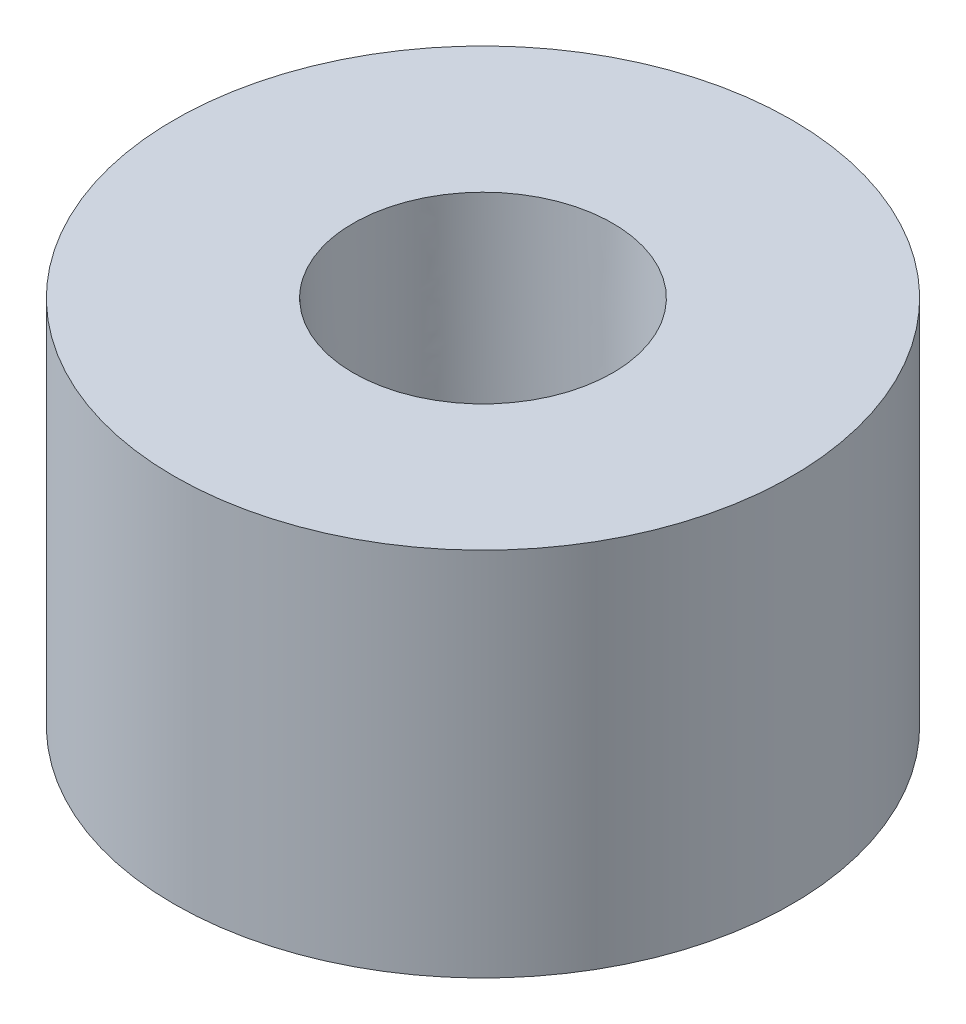
ISO-10303-21;
HEADER;
FILE_DESCRIPTION(('STEP AP214'),'2;1');
FILE_NAME('part.step','',(''),(''),'','','');
FILE_SCHEMA(('AUTOMOTIVE_DESIGN { 1 0 10303 214 1 1 1 1 }'));
ENDSEC;
DATA;
#1=APPLICATION_CONTEXT('core data for automotive mechanical design processes');
#2=APPLICATION_PROTOCOL_DEFINITION('international standard','automotive_design',2000,#1);
#3=PRODUCT_CONTEXT('',#1,'mechanical');
#4=PRODUCT('Part','Part','',(#3));
#5=PRODUCT_RELATED_PRODUCT_CATEGORY('part','',(#4));
#6=PRODUCT_DEFINITION_FORMATION('','',#4);
#7=PRODUCT_DEFINITION_CONTEXT('part definition',#1,'design');
#8=PRODUCT_DEFINITION('design','',#6,#7);
#9=PRODUCT_DEFINITION_SHAPE('','',#8);
#10=(LENGTH_UNIT() NAMED_UNIT(*) SI_UNIT(.MILLI.,.METRE.));
#11=(NAMED_UNIT(*) PLANE_ANGLE_UNIT() SI_UNIT($,.RADIAN.));
#12=(NAMED_UNIT(*) SI_UNIT($,.STERADIAN.) SOLID_ANGLE_UNIT());
#13=UNCERTAINTY_MEASURE_WITH_UNIT(LENGTH_MEASURE(1.E-05),#10,'distance_accuracy_value','');
#14=(GEOMETRIC_REPRESENTATION_CONTEXT(3) GLOBAL_UNCERTAINTY_ASSIGNED_CONTEXT((#13)) GLOBAL_UNIT_ASSIGNED_CONTEXT((#10,
#11,#12)) REPRESENTATION_CONTEXT('',''));
#15=CARTESIAN_POINT('',(0.,0.,0.));
#16=DIRECTION('',(0.,0.,1.));
#17=DIRECTION('',(1.,0.,0.));
#18=AXIS2_PLACEMENT_3D('',#15,#16,#17);
#19=CARTESIAN_POINT('',(0.,15.,0.));
#20=DIRECTION('',(0.,1.,0.));
#21=DIRECTION('',(0.,0.,1.));
#22=AXIS2_PLACEMENT_3D('',#19,#20,#21);
#23=PLANE('',#22);
#24=CARTESIAN_POINT('',(0.,15.,0.));
#25=DIRECTION('',(0.,1.,0.));
#26=DIRECTION('',(0.,0.,1.));
#27=AXIS2_PLACEMENT_3D('',#24,#25,#26);
#28=CIRCLE('',#27,5.25);
#29=CARTESIAN_POINT('',(4.74329606327343,15.,-2.25025386481942));
#30=VERTEX_POINT('',#29);
#31=EDGE_CURVE('E58',#30,#30,#28,.T.);
#32=ORIENTED_EDGE('',*,*,#31,.F.);
#33=EDGE_LOOP('',(#32));
#34=FACE_BOUND('',#33,.T.);
#35=CARTESIAN_POINT('',(0.,15.,0.));
#36=DIRECTION('',(0.,1.,0.));
#37=DIRECTION('',(0.,0.,1.));
#38=AXIS2_PLACEMENT_3D('',#35,#36,#37);
#39=CIRCLE('',#38,12.5);
#40=CARTESIAN_POINT('',(0.,15.,12.5));
#41=VERTEX_POINT('',#40);
#42=EDGE_CURVE('E11',#41,#41,#39,.T.);
#43=ORIENTED_EDGE('',*,*,#42,.T.);
#44=EDGE_LOOP('',(#43));
#45=FACE_BOUND('',#44,.T.);
#46=ADVANCED_FACE('F45',(#34,#45),#23,.T.);
#47=CARTESIAN_POINT('',(0.,0.,0.));
#48=DIRECTION('',(0.,1.,0.));
#49=DIRECTION('',(0.,0.,1.));
#50=AXIS2_PLACEMENT_3D('',#47,#48,#49);
#51=PLANE('',#50);
#52=CARTESIAN_POINT('',(0.,0.,0.));
#53=DIRECTION('',(0.,1.,0.));
#54=DIRECTION('',(0.,0.,1.));
#55=AXIS2_PLACEMENT_3D('',#52,#53,#54);
#56=CIRCLE('',#55,12.5);
#57=CARTESIAN_POINT('',(0.,0.,12.5));
#58=VERTEX_POINT('',#57);
#59=EDGE_CURVE('E49',#58,#58,#56,.T.);
#60=ORIENTED_EDGE('',*,*,#59,.F.);
#61=EDGE_LOOP('',(#60));
#62=FACE_BOUND('',#61,.T.);
#63=CARTESIAN_POINT('',(0.,0.,0.));
#64=DIRECTION('',(0.,-1.,0.));
#65=DIRECTION('',(0.,0.,-1.));
#66=AXIS2_PLACEMENT_3D('',#63,#64,#65);
#67=CIRCLE('',#66,5.);
#68=CARTESIAN_POINT('',(4.02840114825691,0.,-2.96175356650792));
#69=VERTEX_POINT('',#68);
#70=EDGE_CURVE('E63',#69,#69,#67,.T.);
#71=ORIENTED_EDGE('',*,*,#70,.F.);
#72=EDGE_LOOP('',(#71));
#73=FACE_BOUND('',#72,.T.);
#74=ADVANCED_FACE('F71',(#62,#73),#51,.F.);
#75=CARTESIAN_POINT('',(0.,15.,0.));
#76=DIRECTION('',(0.,-1.,0.));
#77=DIRECTION('',(0.,0.,-1.));
#78=AXIS2_PLACEMENT_3D('',#75,#76,#77);
#79=CYLINDRICAL_SURFACE('',#78,12.5);
#80=ORIENTED_EDGE('',*,*,#42,.F.);
#81=EDGE_LOOP('',(#80));
#82=FACE_BOUND('',#81,.T.);
#83=ORIENTED_EDGE('',*,*,#59,.T.);
#84=EDGE_LOOP('',(#83));
#85=FACE_BOUND('',#84,.T.);
#86=ADVANCED_FACE('F47',(#82,#85),#79,.T.);
#87=CARTESIAN_POINT('',(4.02840114825691,0.,-2.96175356650792));
#88=CARTESIAN_POINT('',(4.74329606327343,15.,-2.25025386481942));
#89=CARTESIAN_POINT('',(-1.89510598475894,0.,-11.0185558630217));
#90=CARTESIAN_POINT('',(0.242788333634582,15.,-11.7368459913663));
#91=CARTESIAN_POINT('',(-9.95190828127276,0.,-5.09504873000589));
#92=CARTESIAN_POINT('',(-9.24380379291229,15.,-7.23633826172744));
#93=CARTESIAN_POINT('',(-4.02840114825691,0.,2.96175356650793));
#94=CARTESIAN_POINT('',(-4.74329606327343,15.,2.25025386481943));
#95=CARTESIAN_POINT('',(1.89510598475894,0.,11.0185558630217));
#96=CARTESIAN_POINT('',(-0.242788333634578,15.,11.7368459913663));
#97=CARTESIAN_POINT('',(9.95190828127275,0.,5.09504873000589));
#98=CARTESIAN_POINT('',(9.24380379291228,15.,7.23633826172743));
#99=CARTESIAN_POINT('',(4.02840114825691,0.,-2.96175356650792));
#100=CARTESIAN_POINT('',(4.74329606327343,15.,-2.25025386481942));
#101=(BOUNDED_SURFACE() B_SPLINE_SURFACE(3,1,((#87,#88),(#89,#90),(#91,#92),(#93,#94),(#95,#96),
(#97,#98),(#99,#100)),.UNSPECIFIED.,.T.,.F.,.F.) B_SPLINE_SURFACE_WITH_KNOTS((4,3,4),(2,2),(0.,
0.5,1.),(0.,1.),.UNSPECIFIED.) GEOMETRIC_REPRESENTATION_ITEM() RATIONAL_B_SPLINE_SURFACE(((1.,
1.),(0.333333333333333,0.333333333333333),(0.333333333333333,0.333333333333333),(1.,1.),
(0.333333333333334,0.333333333333333),(0.333333333333334,0.333333333333333),(1.,1.))) REPRESENTATION_ITEM('') SURFACE());
#102=CARTESIAN_POINT('',(4.02840114825691,0.,-2.96175356650792));
#103=CARTESIAN_POINT('',(4.03584797028833,0.15625,-2.954342111282));
#104=CARTESIAN_POINT('',(4.04329479231975,0.3125,-2.94693065605608));
#105=CARTESIAN_POINT('',(4.0581884363826,0.625,-2.93210774560424));
#106=CARTESIAN_POINT('',(4.06563525841402,0.78125,-2.92469629037832));
#107=CARTESIAN_POINT('',(4.08052890247686,1.09375,-2.90987337992647));
#108=CARTESIAN_POINT('',(4.08797572450829,1.25,-2.90246192470055));
#109=CARTESIAN_POINT('',(4.10286936857113,1.5625,-2.88763901424871));
#110=CARTESIAN_POINT('',(4.11031619060255,1.71875,-2.88022755902278));
#111=CARTESIAN_POINT('',(4.1252098346654,2.03125,-2.86540464857094));
#112=CARTESIAN_POINT('',(4.13265665669682,2.1875,-2.85799319334502));
#113=CARTESIAN_POINT('',(4.14755030075966,2.5,-2.84317028289317));
#114=CARTESIAN_POINT('',(4.15499712279109,2.65625,-2.83575882766725));
#115=CARTESIAN_POINT('',(4.16989076685393,2.96875,-2.82093591721541));
#116=CARTESIAN_POINT('',(4.17733758888535,3.125,-2.81352446198949));
#117=CARTESIAN_POINT('',(4.1922312329482,3.4375,-2.79870155153764));
#118=CARTESIAN_POINT('',(4.19967805497962,3.59375,-2.79129009631172));
#119=CARTESIAN_POINT('',(4.21457169904246,3.90625,-2.77646718585988));
#120=CARTESIAN_POINT('',(4.22201852107389,4.0625,-2.76905573063396));
#121=CARTESIAN_POINT('',(4.23691216513673,4.375,-2.75423282018211));
#122=CARTESIAN_POINT('',(4.24435898716815,4.53125,-2.74682136495619));
#123=CARTESIAN_POINT('',(4.25925263123099,4.84375,-2.73199845450435));
#124=CARTESIAN_POINT('',(4.26669945326242,5.,-2.72458699927842));
#125=CARTESIAN_POINT('',(4.28159309732526,5.3125,-2.70976408882658));
#126=CARTESIAN_POINT('',(4.28903991935668,5.46875,-2.70235263360066));
#127=CARTESIAN_POINT('',(4.30393356341953,5.78125,-2.68752972314882));
#128=CARTESIAN_POINT('',(4.31138038545095,5.9375,-2.68011826792289));
#129=CARTESIAN_POINT('',(4.32627402951379,6.25,-2.66529535747105));
#130=CARTESIAN_POINT('',(4.33372085154522,6.40625,-2.65788390224513));
#131=CARTESIAN_POINT('',(4.34861449560806,6.71875,-2.64306099179328));
#132=CARTESIAN_POINT('',(4.35606131763948,6.875,-2.63564953656736));
#133=CARTESIAN_POINT('',(4.37095496170233,7.1875,-2.62082662611552));
#134=CARTESIAN_POINT('',(4.37840178373375,7.34375,-2.6134151708896));
#135=CARTESIAN_POINT('',(4.39329542779659,7.65625,-2.59859226043775));
#136=CARTESIAN_POINT('',(4.40074224982802,7.8125,-2.59118080521183));
#137=CARTESIAN_POINT('',(4.41563589389086,8.125,-2.57635789475999));
#138=CARTESIAN_POINT('',(4.42308271592228,8.28125,-2.56894643953406));
#139=CARTESIAN_POINT('',(4.43797635998513,8.59375,-2.55412352908222));
#140=CARTESIAN_POINT('',(4.44542318201655,8.75,-2.5467120738563));
#141=CARTESIAN_POINT('',(4.46031682607939,9.0625,-2.53188916340446));
#142=CARTESIAN_POINT('',(4.46776364811081,9.21875,-2.52447770817853));
#143=CARTESIAN_POINT('',(4.48265729217366,9.53125,-2.50965479772669));
#144=CARTESIAN_POINT('',(4.49010411420508,9.6875,-2.50224334250077));
#145=CARTESIAN_POINT('',(4.50499775826793,10.,-2.48742043204892));
#146=CARTESIAN_POINT('',(4.51244458029935,10.15625,-2.480008976823));
#147=CARTESIAN_POINT('',(4.52733822436219,10.46875,-2.46518606637116));
#148=CARTESIAN_POINT('',(4.53478504639361,10.625,-2.45777461114524));
#149=CARTESIAN_POINT('',(4.54967869045646,10.9375,-2.44295170069339));
#150=CARTESIAN_POINT('',(4.55712551248788,11.09375,-2.43554024546747));
#151=CARTESIAN_POINT('',(4.57201915655072,11.40625,-2.42071733501563));
#152=CARTESIAN_POINT('',(4.57946597858215,11.5625,-2.41330587978971));
#153=CARTESIAN_POINT('',(4.59435962264499,11.875,-2.39848296933786));
#154=CARTESIAN_POINT('',(4.60180644467641,12.03125,-2.39107151411194));
#155=CARTESIAN_POINT('',(4.61670008873926,12.34375,-2.3762486036601));
#156=CARTESIAN_POINT('',(4.62414691077068,12.5,-2.36883714843417));
#157=CARTESIAN_POINT('',(4.63904055483352,12.8125,-2.35401423798233));
#158=CARTESIAN_POINT('',(4.64648737686495,12.96875,-2.34660278275641));
#159=CARTESIAN_POINT('',(4.66138102092779,13.28125,-2.33177987230456));
#160=CARTESIAN_POINT('',(4.66882784295921,13.4375,-2.32436841707864));
#161=CARTESIAN_POINT('',(4.68372148702206,13.75,-2.3095455066268));
#162=CARTESIAN_POINT('',(4.69116830905348,13.90625,-2.30213405140088));
#163=CARTESIAN_POINT('',(4.70606195311632,14.21875,-2.28731114094903));
#164=CARTESIAN_POINT('',(4.71350877514775,14.375,-2.27989968572311));
#165=CARTESIAN_POINT('',(4.72840241921059,14.6875,-2.26507677527127));
#166=CARTESIAN_POINT('',(4.73584924124201,14.84375,-2.25766532004535));
#167=CARTESIAN_POINT('',(4.74329606327343,15.,-2.25025386481942));
#168=B_SPLINE_CURVE_WITH_KNOTS('',3,(#102,#103,#104,#105,#106,#107,#108,#109,#110,#111,#112,
#113,#114,#115,#116,#117,#118,#119,#120,#121,#122,#123,#124,#125,#126,#127,#128,#129,#130,#131,
#132,#133,#134,#135,#136,#137,#138,#139,#140,#141,#142,#143,#144,#145,#146,#147,#148,#149,#150,
#151,#152,#153,#154,#155,#156,#157,#158,#159,#160,#161,#162,#163,#164,#165,#166,#167),
.UNSPECIFIED.,.F.,.F.,(4,2,2,2,2,2,2,2,2,2,2,2,2,2,2,2,2,2,2,2,2,2,2,2,2,2,2,2,2,2,2,2,4),(0.,
0.469808499223249,0.939616998446498,1.40942549766975,1.879233996893,2.34904249611625,
2.81885099533949,3.28865949456274,3.75846799378599,4.22827649300924,4.69808499223249,
5.16789349145574,5.63770199067899,6.10751048990224,6.57731898912549,7.04712748834874,
7.51693598757199,7.98674448679524,8.45655298601849,8.92636148524173,9.39616998446498,
9.86597848368823,10.3357869829115,10.8055954821347,11.275403981358,11.7452124805812,
12.2150209798045,12.6848294790277,13.154637978251,13.6244464774742,14.0942549766975,
14.5640634759207,15.033871975144),.UNSPECIFIED.);
#169=EDGE_CURVE('BSEAM68',#69,#30,#168,.T.);
#170=ORIENTED_EDGE('',*,*,#70,.T.);
#171=ORIENTED_EDGE('',*,*,#31,.T.);
#172=ORIENTED_EDGE('',*,*,#169,.T.);
#173=ORIENTED_EDGE('',*,*,#169,.F.);
#174=EDGE_LOOP('',(#170,#172,#171,#173));
#175=FACE_BOUND('',#174,.T.);
#176=ADVANCED_FACE('F68',(#175),#101,.F.);
#177=CLOSED_SHELL('',(#46,#74,#86,#176));
#178=MANIFOLD_SOLID_BREP('B2',#177);
#179=ADVANCED_BREP_SHAPE_REPRESENTATION('',(#18,#178),#14);
#180=SHAPE_DEFINITION_REPRESENTATION(#9,#179);
ENDSEC;
END-ISO-10303-21;
